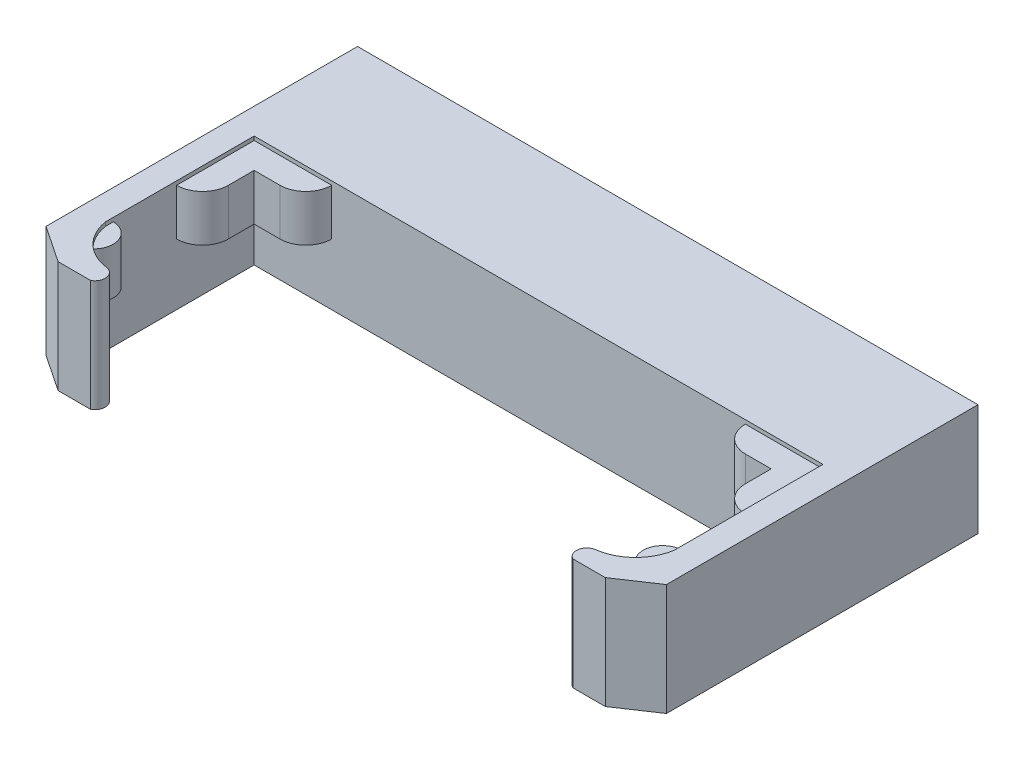
ISO-10303-21;
HEADER;
FILE_DESCRIPTION(('STEP AP214'),'2;1');
FILE_NAME('part.step','',(''),(''),'','','');
FILE_SCHEMA(('AUTOMOTIVE_DESIGN { 1 0 10303 214 1 1 1 1 }'));
ENDSEC;
DATA;
#1=APPLICATION_CONTEXT('core data for automotive mechanical design processes');
#2=APPLICATION_PROTOCOL_DEFINITION('international standard','automotive_design',2000,#1);
#3=PRODUCT_CONTEXT('',#1,'mechanical');
#4=PRODUCT('Part','Part','',(#3));
#5=PRODUCT_RELATED_PRODUCT_CATEGORY('part','',(#4));
#6=PRODUCT_DEFINITION_FORMATION('','',#4);
#7=PRODUCT_DEFINITION_CONTEXT('part definition',#1,'design');
#8=PRODUCT_DEFINITION('design','',#6,#7);
#9=PRODUCT_DEFINITION_SHAPE('','',#8);
#10=(LENGTH_UNIT() NAMED_UNIT(*) SI_UNIT(.MILLI.,.METRE.));
#11=(NAMED_UNIT(*) PLANE_ANGLE_UNIT() SI_UNIT($,.RADIAN.));
#12=(NAMED_UNIT(*) SI_UNIT($,.STERADIAN.) SOLID_ANGLE_UNIT());
#13=UNCERTAINTY_MEASURE_WITH_UNIT(LENGTH_MEASURE(1.E-05),#10,'distance_accuracy_value','');
#14=(GEOMETRIC_REPRESENTATION_CONTEXT(3) GLOBAL_UNCERTAINTY_ASSIGNED_CONTEXT((#13)) GLOBAL_UNIT_ASSIGNED_CONTEXT((#10,
#11,#12)) REPRESENTATION_CONTEXT('',''));
#15=CARTESIAN_POINT('',(0.,0.,0.));
#16=DIRECTION('',(0.,0.,1.));
#17=DIRECTION('',(1.,0.,0.));
#18=AXIS2_PLACEMENT_3D('',#15,#16,#17);
#19=CARTESIAN_POINT('',(0.,22.5,0.));
#20=DIRECTION('',(0.,1.,0.));
#21=DIRECTION('',(0.,0.,1.));
#22=AXIS2_PLACEMENT_3D('',#19,#20,#21);
#23=PLANE('',#22);
#24=DIRECTION('',(0.,0.,-1.));
#25=VECTOR('',#24,1.);
#26=CARTESIAN_POINT('',(-110.,22.5,0.));
#27=LINE('',#26,#25);
#28=CARTESIAN_POINT('',(-110.,22.5,-20.));
#29=VERTEX_POINT('',#28);
#30=CARTESIAN_POINT('',(-110.,22.5,-50.));
#31=VERTEX_POINT('',#30);
#32=EDGE_CURVE('E69',#29,#31,#27,.T.);
#33=ORIENTED_EDGE('',*,*,#32,.F.);
#34=CARTESIAN_POINT('',(-110.,22.5,-30.));
#35=DIRECTION('',(0.,1.,0.));
#36=DIRECTION('',(0.,0.,1.));
#37=AXIS2_PLACEMENT_3D('',#34,#35,#36);
#38=CIRCLE('',#37,9.99999999999999);
#39=CARTESIAN_POINT('',(-100.,22.5,-30.));
#40=VERTEX_POINT('',#39);
#41=EDGE_CURVE('E142',#29,#40,#38,.T.);
#42=ORIENTED_EDGE('',*,*,#41,.T.);
#43=DIRECTION('',(0.,0.,1.));
#44=VECTOR('',#43,1.);
#45=CARTESIAN_POINT('',(-100.,22.5,0.));
#46=LINE('',#45,#44);
#47=CARTESIAN_POINT('',(-100.,22.5,-40.));
#48=VERTEX_POINT('',#47);
#49=EDGE_CURVE('E144',#48,#40,#46,.T.);
#50=ORIENTED_EDGE('',*,*,#49,.F.);
#51=DIRECTION('',(1.,0.,0.));
#52=VECTOR('',#51,1.);
#53=CARTESIAN_POINT('',(0.,22.5,-40.));
#54=LINE('',#53,#52);
#55=CARTESIAN_POINT('',(-90.,22.5,-40.));
#56=VERTEX_POINT('',#55);
#57=EDGE_CURVE('E101',#48,#56,#54,.T.);
#58=ORIENTED_EDGE('',*,*,#57,.T.);
#59=CARTESIAN_POINT('',(-90.,22.5,-50.));
#60=DIRECTION('',(0.,1.,0.));
#61=DIRECTION('',(0.,0.,1.));
#62=AXIS2_PLACEMENT_3D('',#59,#60,#61);
#63=CIRCLE('',#62,9.99999999999999);
#64=CARTESIAN_POINT('',(-80.,22.5,-50.));
#65=VERTEX_POINT('',#64);
#66=EDGE_CURVE('E106',#56,#65,#63,.T.);
#67=ORIENTED_EDGE('',*,*,#66,.T.);
#68=DIRECTION('',(1.,0.,0.));
#69=VECTOR('',#68,1.);
#70=CARTESIAN_POINT('',(0.,22.5,-50.));
#71=LINE('',#70,#69);
#72=EDGE_CURVE('E113',#31,#65,#71,.T.);
#73=ORIENTED_EDGE('',*,*,#72,.F.);
#74=EDGE_LOOP('',(#33,#42,#50,#58,#67,#73));
#75=FACE_BOUND('',#74,.T.);
#76=ADVANCED_FACE('F59',(#75),#23,.T.);
#77=CARTESIAN_POINT('',(0.,4.5,0.));
#78=DIRECTION('',(0.,1.,0.));
#79=DIRECTION('',(0.,0.,1.));
#80=AXIS2_PLACEMENT_3D('',#77,#78,#79);
#81=PLANE('',#80);
#82=DIRECTION('',(0.,0.,-1.));
#83=VECTOR('',#82,1.);
#84=CARTESIAN_POINT('',(-110.,4.5,0.));
#85=LINE('',#84,#83);
#86=CARTESIAN_POINT('',(-110.,4.5,-20.));
#87=VERTEX_POINT('',#86);
#88=CARTESIAN_POINT('',(-110.,4.5,-50.));
#89=VERTEX_POINT('',#88);
#90=EDGE_CURVE('E128',#87,#89,#85,.T.);
#91=ORIENTED_EDGE('',*,*,#90,.T.);
#92=DIRECTION('',(1.,0.,0.));
#93=VECTOR('',#92,1.);
#94=CARTESIAN_POINT('',(0.,4.5,-50.));
#95=LINE('',#94,#93);
#96=CARTESIAN_POINT('',(-80.,4.5,-50.));
#97=VERTEX_POINT('',#96);
#98=EDGE_CURVE('E124',#89,#97,#95,.T.);
#99=ORIENTED_EDGE('',*,*,#98,.T.);
#100=CARTESIAN_POINT('',(-90.,4.5,-50.));
#101=DIRECTION('',(0.,1.,0.));
#102=DIRECTION('',(0.,0.,1.));
#103=AXIS2_PLACEMENT_3D('',#100,#101,#102);
#104=CIRCLE('',#103,9.99999999999999);
#105=CARTESIAN_POINT('',(-90.,4.5,-40.));
#106=VERTEX_POINT('',#105);
#107=EDGE_CURVE('E133',#106,#97,#104,.T.);
#108=ORIENTED_EDGE('',*,*,#107,.F.);
#109=DIRECTION('',(1.,0.,0.));
#110=VECTOR('',#109,1.);
#111=CARTESIAN_POINT('',(0.,4.5,-40.));
#112=LINE('',#111,#110);
#113=CARTESIAN_POINT('',(-100.,4.5,-40.));
#114=VERTEX_POINT('',#113);
#115=EDGE_CURVE('E136',#114,#106,#112,.T.);
#116=ORIENTED_EDGE('',*,*,#115,.F.);
#117=DIRECTION('',(0.,0.,1.));
#118=VECTOR('',#117,1.);
#119=CARTESIAN_POINT('',(-100.,4.5,0.));
#120=LINE('',#119,#118);
#121=CARTESIAN_POINT('',(-100.,4.5,-30.));
#122=VERTEX_POINT('',#121);
#123=EDGE_CURVE('E112',#114,#122,#120,.T.);
#124=ORIENTED_EDGE('',*,*,#123,.T.);
#125=CARTESIAN_POINT('',(-110.,4.5,-30.));
#126=DIRECTION('',(0.,1.,0.));
#127=DIRECTION('',(0.,0.,1.));
#128=AXIS2_PLACEMENT_3D('',#125,#126,#127);
#129=CIRCLE('',#128,9.99999999999999);
#130=EDGE_CURVE('E119',#87,#122,#129,.T.);
#131=ORIENTED_EDGE('',*,*,#130,.F.);
#132=EDGE_LOOP('',(#91,#99,#108,#116,#124,#131));
#133=FACE_BOUND('',#132,.T.);
#134=ADVANCED_FACE('F165',(#133),#81,.F.);
#135=CARTESIAN_POINT('',(0.,64.9264068711929,-50.));
#136=DIRECTION('',(0.,0.,-1.));
#137=DIRECTION('',(-1.,0.,0.));
#138=AXIS2_PLACEMENT_3D('',#135,#136,#137);
#139=PLANE('',#138);
#140=DIRECTION('',(0.,-1.,0.));
#141=VECTOR('',#140,1.);
#142=CARTESIAN_POINT('',(-110.,64.9264068711929,-50.));
#143=LINE('',#142,#141);
#144=EDGE_CURVE('E12',#31,#89,#143,.T.);
#145=ORIENTED_EDGE('',*,*,#144,.F.);
#146=ORIENTED_EDGE('',*,*,#72,.T.);
#147=DIRECTION('',(0.,-1.,0.));
#148=VECTOR('',#147,1.);
#149=CARTESIAN_POINT('',(-80.,64.9264068711929,-50.));
#150=LINE('',#149,#148);
#151=EDGE_CURVE('E114',#65,#97,#150,.T.);
#152=ORIENTED_EDGE('',*,*,#151,.T.);
#153=ORIENTED_EDGE('',*,*,#98,.F.);
#154=EDGE_LOOP('',(#145,#146,#152,#153));
#155=FACE_BOUND('',#154,.T.);
#156=ADVANCED_FACE('F123',(#155),#139,.T.);
#157=CARTESIAN_POINT('',(-90.,64.9264068711929,-50.));
#158=DIRECTION('',(0.,-1.,0.));
#159=DIRECTION('',(0.,0.,-1.));
#160=AXIS2_PLACEMENT_3D('',#157,#158,#159);
#161=CYLINDRICAL_SURFACE('',#160,9.99999999999999);
#162=ORIENTED_EDGE('',*,*,#66,.F.);
#163=DIRECTION('',(0.,-1.,0.));
#164=VECTOR('',#163,1.);
#165=CARTESIAN_POINT('',(-90.,64.9264068711929,-40.));
#166=LINE('',#165,#164);
#167=EDGE_CURVE('E139',#56,#106,#166,.T.);
#168=ORIENTED_EDGE('',*,*,#167,.T.);
#169=ORIENTED_EDGE('',*,*,#107,.T.);
#170=ORIENTED_EDGE('',*,*,#151,.F.);
#171=EDGE_LOOP('',(#162,#168,#169,#170));
#172=FACE_BOUND('',#171,.T.);
#173=ADVANCED_FACE('F157',(#172),#161,.T.);
#174=CARTESIAN_POINT('',(0.,64.9264068711929,-40.));
#175=DIRECTION('',(0.,0.,-1.));
#176=DIRECTION('',(-1.,0.,0.));
#177=AXIS2_PLACEMENT_3D('',#174,#175,#176);
#178=PLANE('',#177);
#179=ORIENTED_EDGE('',*,*,#57,.F.);
#180=DIRECTION('',(0.,-1.,0.));
#181=VECTOR('',#180,1.);
#182=CARTESIAN_POINT('',(-100.,64.9264068711929,-40.));
#183=LINE('',#182,#181);
#184=EDGE_CURVE('E140',#48,#114,#183,.T.);
#185=ORIENTED_EDGE('',*,*,#184,.T.);
#186=ORIENTED_EDGE('',*,*,#115,.T.);
#187=ORIENTED_EDGE('',*,*,#167,.F.);
#188=EDGE_LOOP('',(#179,#185,#186,#187));
#189=FACE_BOUND('',#188,.T.);
#190=ADVANCED_FACE('F159',(#189),#178,.F.);
#191=CARTESIAN_POINT('',(-100.,64.9264068711929,0.));
#192=DIRECTION('',(1.,0.,0.));
#193=DIRECTION('',(0.,0.,-1.));
#194=AXIS2_PLACEMENT_3D('',#191,#192,#193);
#195=PLANE('',#194);
#196=ORIENTED_EDGE('',*,*,#184,.F.);
#197=ORIENTED_EDGE('',*,*,#49,.T.);
#198=DIRECTION('',(0.,-1.,0.));
#199=VECTOR('',#198,1.);
#200=CARTESIAN_POINT('',(-100.,64.9264068711929,-30.));
#201=LINE('',#200,#199);
#202=EDGE_CURVE('E148',#40,#122,#201,.T.);
#203=ORIENTED_EDGE('',*,*,#202,.T.);
#204=ORIENTED_EDGE('',*,*,#123,.F.);
#205=EDGE_LOOP('',(#196,#197,#203,#204));
#206=FACE_BOUND('',#205,.T.);
#207=ADVANCED_FACE('F177',(#206),#195,.T.);
#208=CARTESIAN_POINT('',(-110.,64.9264068711929,-30.));
#209=DIRECTION('',(0.,-1.,0.));
#210=DIRECTION('',(0.,0.,-1.));
#211=AXIS2_PLACEMENT_3D('',#208,#209,#210);
#212=CYLINDRICAL_SURFACE('',#211,9.99999999999999);
#213=ORIENTED_EDGE('',*,*,#41,.F.);
#214=DIRECTION('',(0.,-1.,0.));
#215=VECTOR('',#214,1.);
#216=CARTESIAN_POINT('',(-110.,64.9264068711929,-20.));
#217=LINE('',#216,#215);
#218=EDGE_CURVE('E118',#29,#87,#217,.T.);
#219=ORIENTED_EDGE('',*,*,#218,.T.);
#220=ORIENTED_EDGE('',*,*,#130,.T.);
#221=ORIENTED_EDGE('',*,*,#202,.F.);
#222=EDGE_LOOP('',(#213,#219,#220,#221));
#223=FACE_BOUND('',#222,.T.);
#224=ADVANCED_FACE('F174',(#223),#212,.T.);
#225=CARTESIAN_POINT('',(-110.,64.9264068711929,0.));
#226=DIRECTION('',(-1.,0.,0.));
#227=DIRECTION('',(0.,0.,1.));
#228=AXIS2_PLACEMENT_3D('',#225,#226,#227);
#229=PLANE('',#228);
#230=ORIENTED_EDGE('',*,*,#218,.F.);
#231=ORIENTED_EDGE('',*,*,#32,.T.);
#232=ORIENTED_EDGE('',*,*,#144,.T.);
#233=ORIENTED_EDGE('',*,*,#90,.F.);
#234=EDGE_LOOP('',(#230,#231,#232,#233));
#235=FACE_BOUND('',#234,.T.);
#236=ADVANCED_FACE('F120',(#235),#229,.T.);
#237=CLOSED_SHELL('',(#76,#134,#156,#173,#190,#207,#224,#236));
#238=MANIFOLD_SOLID_BREP('B2',#237);
#239=CARTESIAN_POINT('',(-110.,64.9264068711929,-2.03540887847945E-13));
#240=DIRECTION('',(1.,0.,0.));
#241=DIRECTION('',(0.,0.,-1.));
#242=AXIS2_PLACEMENT_3D('',#239,#240,#241);
#243=PLANE('',#242);
#244=DIRECTION('',(0.,0.,1.));
#245=VECTOR('',#244,1.);
#246=CARTESIAN_POINT('',(-110.,22.5,-2.03540887847945E-13));
#247=LINE('',#246,#245);
#248=CARTESIAN_POINT('',(-110.,22.5,4.5));
#249=VERTEX_POINT('',#248);
#250=CARTESIAN_POINT('',(-110.,22.5,19.5));
#251=VERTEX_POINT('',#250);
#252=EDGE_CURVE('E57',#249,#251,#247,.T.);
#253=ORIENTED_EDGE('',*,*,#252,.F.);
#254=DIRECTION('',(0.,-1.,0.));
#255=VECTOR('',#254,1.);
#256=CARTESIAN_POINT('',(-110.,64.9264068711929,4.5));
#257=LINE('',#256,#255);
#258=CARTESIAN_POINT('',(-110.,4.5,4.5));
#259=VERTEX_POINT('',#258);
#260=EDGE_CURVE('E287',#249,#259,#257,.T.);
#261=ORIENTED_EDGE('',*,*,#260,.T.);
#262=DIRECTION('',(0.,0.,1.));
#263=VECTOR('',#262,1.);
#264=CARTESIAN_POINT('',(-110.,4.5,-2.03540887847945E-13));
#265=LINE('',#264,#263);
#266=CARTESIAN_POINT('',(-110.,4.5,19.5));
#267=VERTEX_POINT('',#266);
#268=EDGE_CURVE('E312',#259,#267,#265,.T.);
#269=ORIENTED_EDGE('',*,*,#268,.T.);
#270=DIRECTION('',(0.,-1.,0.));
#271=VECTOR('',#270,1.);
#272=CARTESIAN_POINT('',(-110.,64.9264068711929,19.5));
#273=LINE('',#272,#271);
#274=EDGE_CURVE('E304',#251,#267,#273,.T.);
#275=ORIENTED_EDGE('',*,*,#274,.F.);
#276=EDGE_LOOP('',(#253,#261,#269,#275));
#277=FACE_BOUND('',#276,.T.);
#278=ADVANCED_FACE('F285',(#277),#243,.F.);
#279=CARTESIAN_POINT('',(-110.,64.9264068711929,12.));
#280=DIRECTION('',(0.,-1.,0.));
#281=DIRECTION('',(0.,0.,-1.));
#282=AXIS2_PLACEMENT_3D('',#279,#280,#281);
#283=CYLINDRICAL_SURFACE('',#282,7.5);
#284=CARTESIAN_POINT('',(-110.,22.5,12.));
#285=DIRECTION('',(0.,1.,0.));
#286=DIRECTION('',(0.,0.,1.));
#287=AXIS2_PLACEMENT_3D('',#284,#285,#286);
#288=CIRCLE('',#287,7.5);
#289=EDGE_CURVE('E294',#251,#249,#288,.T.);
#290=ORIENTED_EDGE('',*,*,#289,.F.);
#291=ORIENTED_EDGE('',*,*,#274,.T.);
#292=CARTESIAN_POINT('',(-110.,4.5,12.));
#293=DIRECTION('',(0.,1.,0.));
#294=DIRECTION('',(0.,0.,1.));
#295=AXIS2_PLACEMENT_3D('',#292,#293,#294);
#296=CIRCLE('',#295,7.5);
#297=EDGE_CURVE('E314',#267,#259,#296,.T.);
#298=ORIENTED_EDGE('',*,*,#297,.T.);
#299=ORIENTED_EDGE('',*,*,#260,.F.);
#300=EDGE_LOOP('',(#290,#291,#298,#299));
#301=FACE_BOUND('',#300,.T.);
#302=ADVANCED_FACE('F311',(#301),#283,.T.);
#303=CARTESIAN_POINT('',(0.,4.5,0.));
#304=DIRECTION('',(0.,1.,0.));
#305=DIRECTION('',(0.,0.,1.));
#306=AXIS2_PLACEMENT_3D('',#303,#304,#305);
#307=PLANE('',#306);
#308=ORIENTED_EDGE('',*,*,#268,.F.);
#309=ORIENTED_EDGE('',*,*,#297,.F.);
#310=EDGE_LOOP('',(#308,#309));
#311=FACE_BOUND('',#310,.T.);
#312=ADVANCED_FACE('F316',(#311),#307,.F.);
#313=CARTESIAN_POINT('',(0.,22.5,0.));
#314=DIRECTION('',(0.,1.,0.));
#315=DIRECTION('',(0.,0.,1.));
#316=AXIS2_PLACEMENT_3D('',#313,#314,#315);
#317=PLANE('',#316);
#318=ORIENTED_EDGE('',*,*,#289,.T.);
#319=ORIENTED_EDGE('',*,*,#252,.T.);
#320=EDGE_LOOP('',(#318,#319));
#321=FACE_BOUND('',#320,.T.);
#322=ADVANCED_FACE('F281',(#321),#317,.T.);
#323=CLOSED_SHELL('',(#278,#302,#312,#322));
#324=MANIFOLD_SOLID_BREP('B6',#323);
#325=CARTESIAN_POINT('',(92.2220271706998,-19.2,4.68154615424301));
#326=DIRECTION('',(0.,1.,0.));
#327=DIRECTION('',(0.,0.,1.));
#328=AXIS2_PLACEMENT_3D('',#325,#326,#327);
#329=CYLINDRICAL_SURFACE('',#328,18.);
#330=DIRECTION('',(0.,-1.,0.));
#331=VECTOR('',#330,1.);
#332=CARTESIAN_POINT('',(104.879251681578,13.5,17.4797752380349));
#333=LINE('',#332,#331);
#334=CARTESIAN_POINT('',(104.879251681578,22.5,17.4797752380349));
#335=VERTEX_POINT('',#334);
#336=CARTESIAN_POINT('',(104.879251681578,4.5,17.4797752380349));
#337=VERTEX_POINT('',#336);
#338=EDGE_CURVE('E396',#335,#337,#333,.T.);
#339=ORIENTED_EDGE('',*,*,#338,.T.);
#340=CARTESIAN_POINT('',(92.2220271706998,4.5,4.68154615424301));
#341=DIRECTION('',(0.,1.,0.));
#342=DIRECTION('',(0.,0.,1.));
#343=AXIS2_PLACEMENT_3D('',#340,#341,#342);
#344=CIRCLE('',#343,18.);
#345=CARTESIAN_POINT('',(110.,4.5,7.50000000000001));
#346=VERTEX_POINT('',#345);
#347=EDGE_CURVE('E598',#337,#346,#344,.T.);
#348=ORIENTED_EDGE('',*,*,#347,.T.);
#349=DIRECTION('',(0.,1.,0.));
#350=VECTOR('',#349,1.);
#351=CARTESIAN_POINT('',(110.,-19.2,7.50000000000001));
#352=LINE('',#351,#350);
#353=CARTESIAN_POINT('',(110.,-19.2,7.50000000000001));
#354=VERTEX_POINT('',#353);
#355=EDGE_CURVE('E691',#354,#346,#352,.T.);
#356=ORIENTED_EDGE('',*,*,#355,.F.);
#357=CARTESIAN_POINT('',(92.2220271706998,-19.2,4.68154615424301));
#358=DIRECTION('',(0.,-1.,0.));
#359=DIRECTION('',(0.,0.,1.));
#360=AXIS2_PLACEMENT_3D('',#357,#358,#359);
#361=CIRCLE('',#360,18.);
#362=CARTESIAN_POINT('',(94.5,-19.2,22.5368209992005));
#363=VERTEX_POINT('',#362);
#364=EDGE_CURVE('E667',#354,#363,#361,.T.);
#365=ORIENTED_EDGE('',*,*,#364,.T.);
#366=DIRECTION('',(0.,1.,0.));
#367=VECTOR('',#366,1.);
#368=CARTESIAN_POINT('',(94.5,-19.2,22.5368209992005));
#369=LINE('',#368,#367);
#370=CARTESIAN_POINT('',(94.5,24.,22.5368209992005));
#371=VERTEX_POINT('',#370);
#372=EDGE_CURVE('E688',#363,#371,#369,.T.);
#373=ORIENTED_EDGE('',*,*,#372,.T.);
#374=CARTESIAN_POINT('',(92.2220271706998,24.,4.68154615424301));
#375=DIRECTION('',(0.,-1.,0.));
#376=DIRECTION('',(0.,0.,1.));
#377=AXIS2_PLACEMENT_3D('',#374,#375,#376);
#378=CIRCLE('',#377,18.);
#379=CARTESIAN_POINT('',(110.,24.,7.50000000000001));
#380=VERTEX_POINT('',#379);
#381=EDGE_CURVE('E632',#380,#371,#378,.T.);
#382=ORIENTED_EDGE('',*,*,#381,.F.);
#383=CARTESIAN_POINT('',(110.,22.5,7.50000000000001));
#384=VERTEX_POINT('',#383);
#385=EDGE_CURVE('E692',#384,#380,#352,.T.);
#386=ORIENTED_EDGE('',*,*,#385,.F.);
#387=CARTESIAN_POINT('',(92.2220271706998,22.5,4.68154615424301));
#388=DIRECTION('',(0.,1.,0.));
#389=DIRECTION('',(0.,0.,1.));
#390=AXIS2_PLACEMENT_3D('',#387,#388,#389);
#391=CIRCLE('',#390,18.);
#392=EDGE_CURVE('E596',#335,#384,#391,.T.);
#393=ORIENTED_EDGE('',*,*,#392,.F.);
#394=EDGE_LOOP('',(#339,#348,#356,#365,#373,#382,#386,#393));
#395=FACE_BOUND('',#394,.T.);
#396=ADVANCED_FACE('F371',(#395),#329,.F.);
#397=CARTESIAN_POINT('',(110.,-19.2,7.50000000000001));
#398=DIRECTION('',(-1.,0.,0.));
#399=DIRECTION('',(0.,0.,1.));
#400=AXIS2_PLACEMENT_3D('',#397,#398,#399);
#401=PLANE('',#400);
#402=DIRECTION('',(0.,0.,-1.));
#403=VECTOR('',#402,1.);
#404=CARTESIAN_POINT('',(110.,22.5,0.));
#405=LINE('',#404,#403);
#406=CARTESIAN_POINT('',(110.,22.5,-20.));
#407=VERTEX_POINT('',#406);
#408=CARTESIAN_POINT('',(110.,22.5,-50.));
#409=VERTEX_POINT('',#408);
#410=EDGE_CURVE('E545',#407,#409,#405,.T.);
#411=ORIENTED_EDGE('',*,*,#410,.F.);
#412=DIRECTION('',(0.,-1.,0.));
#413=VECTOR('',#412,1.);
#414=CARTESIAN_POINT('',(110.,64.9264068711929,-20.));
#415=LINE('',#414,#413);
#416=CARTESIAN_POINT('',(110.,4.5,-20.));
#417=VERTEX_POINT('',#416);
#418=EDGE_CURVE('E529',#407,#417,#415,.T.);
#419=ORIENTED_EDGE('',*,*,#418,.T.);
#420=DIRECTION('',(0.,0.,-1.));
#421=VECTOR('',#420,1.);
#422=CARTESIAN_POINT('',(110.,4.5,0.));
#423=LINE('',#422,#421);
#424=CARTESIAN_POINT('',(110.,4.5,-50.));
#425=VERTEX_POINT('',#424);
#426=EDGE_CURVE('E563',#417,#425,#423,.T.);
#427=ORIENTED_EDGE('',*,*,#426,.T.);
#428=DIRECTION('',(0.,1.,0.));
#429=VECTOR('',#428,1.);
#430=CARTESIAN_POINT('',(110.,-19.2,-50.));
#431=LINE('',#430,#429);
#432=CARTESIAN_POINT('',(110.,-19.2,-50.));
#433=VERTEX_POINT('',#432);
#434=EDGE_CURVE('E696',#433,#425,#431,.T.);
#435=ORIENTED_EDGE('',*,*,#434,.F.);
#436=DIRECTION('',(0.,0.,1.));
#437=VECTOR('',#436,1.);
#438=CARTESIAN_POINT('',(110.,-19.2,7.50000000000001));
#439=LINE('',#438,#437);
#440=EDGE_CURVE('E666',#433,#354,#439,.T.);
#441=ORIENTED_EDGE('',*,*,#440,.T.);
#442=ORIENTED_EDGE('',*,*,#355,.T.);
#443=DIRECTION('',(0.,0.,1.));
#444=VECTOR('',#443,1.);
#445=CARTESIAN_POINT('',(110.,4.5,-2.03540887847945E-13));
#446=LINE('',#445,#444);
#447=CARTESIAN_POINT('',(110.,4.5,4.5));
#448=VERTEX_POINT('',#447);
#449=EDGE_CURVE('E590',#448,#346,#446,.T.);
#450=ORIENTED_EDGE('',*,*,#449,.F.);
#451=DIRECTION('',(0.,-1.,0.));
#452=VECTOR('',#451,1.);
#453=CARTESIAN_POINT('',(110.,64.9264068711929,4.5));
#454=LINE('',#453,#452);
#455=CARTESIAN_POINT('',(110.,22.5,4.5));
#456=VERTEX_POINT('',#455);
#457=EDGE_CURVE('E581',#456,#448,#454,.T.);
#458=ORIENTED_EDGE('',*,*,#457,.F.);
#459=DIRECTION('',(0.,0.,1.));
#460=VECTOR('',#459,1.);
#461=CARTESIAN_POINT('',(110.,22.5,-2.03540887847945E-13));
#462=LINE('',#461,#460);
#463=EDGE_CURVE('E536',#456,#384,#462,.T.);
#464=ORIENTED_EDGE('',*,*,#463,.T.);
#465=ORIENTED_EDGE('',*,*,#385,.T.);
#466=DIRECTION('',(0.,0.,1.));
#467=VECTOR('',#466,1.);
#468=CARTESIAN_POINT('',(110.,24.,7.50000000000001));
#469=LINE('',#468,#467);
#470=CARTESIAN_POINT('',(110.,24.,-50.));
#471=VERTEX_POINT('',#470);
#472=EDGE_CURVE('E626',#471,#380,#469,.T.);
#473=ORIENTED_EDGE('',*,*,#472,.F.);
#474=EDGE_CURVE('E552',#409,#471,#431,.T.);
#475=ORIENTED_EDGE('',*,*,#474,.F.);
#476=EDGE_LOOP('',(#411,#419,#427,#435,#441,#442,#450,#458,#464,#465,#473,#475));
#477=FACE_BOUND('',#476,.T.);
#478=ADVANCED_FACE('F548',(#477),#401,.T.);
#479=CARTESIAN_POINT('',(-120.,-19.2,-100.));
#480=DIRECTION('',(0.,0.,-1.));
#481=DIRECTION('',(-1.,0.,0.));
#482=AXIS2_PLACEMENT_3D('',#479,#480,#481);
#483=PLANE('',#482);
#484=DIRECTION('',(0.,1.,0.));
#485=VECTOR('',#484,1.);
#486=CARTESIAN_POINT('',(-120.,-19.2,-100.));
#487=LINE('',#486,#485);
#488=CARTESIAN_POINT('',(-120.,-19.2,-100.));
#489=VERTEX_POINT('',#488);
#490=CARTESIAN_POINT('',(-120.,24.,-100.));
#491=VERTEX_POINT('',#490);
#492=EDGE_CURVE('E279',#489,#491,#487,.T.);
#493=ORIENTED_EDGE('',*,*,#492,.T.);
#494=DIRECTION('',(-1.,0.,0.));
#495=VECTOR('',#494,1.);
#496=CARTESIAN_POINT('',(-120.,24.,-100.));
#497=LINE('',#496,#495);
#498=CARTESIAN_POINT('',(120.,24.,-100.));
#499=VERTEX_POINT('',#498);
#500=EDGE_CURVE('E642',#499,#491,#497,.T.);
#501=ORIENTED_EDGE('',*,*,#500,.F.);
#502=DIRECTION('',(0.,1.,0.));
#503=VECTOR('',#502,1.);
#504=CARTESIAN_POINT('',(120.,-19.2,-100.));
#505=LINE('',#504,#503);
#506=CARTESIAN_POINT('',(120.,-19.2,-100.));
#507=VERTEX_POINT('',#506);
#508=EDGE_CURVE('E378',#507,#499,#505,.T.);
#509=ORIENTED_EDGE('',*,*,#508,.F.);
#510=DIRECTION('',(-1.,0.,0.));
#511=VECTOR('',#510,1.);
#512=CARTESIAN_POINT('',(-120.,-19.2,-100.));
#513=LINE('',#512,#511);
#514=EDGE_CURVE('E682',#507,#489,#513,.T.);
#515=ORIENTED_EDGE('',*,*,#514,.T.);
#516=EDGE_LOOP('',(#493,#501,#509,#515));
#517=FACE_BOUND('',#516,.T.);
#518=ADVANCED_FACE('F768',(#517),#483,.T.);
#519=CARTESIAN_POINT('',(120.,-19.2,-100.));
#520=DIRECTION('',(1.,0.,0.));
#521=DIRECTION('',(0.,0.,-1.));
#522=AXIS2_PLACEMENT_3D('',#519,#520,#521);
#523=PLANE('',#522);
#524=ORIENTED_EDGE('',*,*,#508,.T.);
#525=DIRECTION('',(0.,0.,-1.));
#526=VECTOR('',#525,1.);
#527=CARTESIAN_POINT('',(120.,24.,-50.));
#528=LINE('',#527,#526);
#529=CARTESIAN_POINT('',(120.,24.,20.5094860364625));
#530=VERTEX_POINT('',#529);
#531=EDGE_CURVE('E641',#530,#499,#528,.T.);
#532=ORIENTED_EDGE('',*,*,#531,.F.);
#533=DIRECTION('',(0.,1.,0.));
#534=VECTOR('',#533,1.);
#535=CARTESIAN_POINT('',(120.,-19.2,20.5094860364625));
#536=LINE('',#535,#534);
#537=CARTESIAN_POINT('',(120.,-19.2,20.5094860364625));
#538=VERTEX_POINT('',#537);
#539=EDGE_CURVE('E607',#538,#530,#536,.T.);
#540=ORIENTED_EDGE('',*,*,#539,.F.);
#541=DIRECTION('',(0.,0.,-1.));
#542=VECTOR('',#541,1.);
#543=CARTESIAN_POINT('',(120.,-19.2,-50.));
#544=LINE('',#543,#542);
#545=EDGE_CURVE('E676',#538,#507,#544,.T.);
#546=ORIENTED_EDGE('',*,*,#545,.T.);
#547=EDGE_LOOP('',(#524,#532,#540,#546));
#548=FACE_BOUND('',#547,.T.);
#549=ADVANCED_FACE('F802',(#548),#523,.T.);
#550=CARTESIAN_POINT('',(105.831019796753,-19.2,30.));
#551=DIRECTION('',(0.,0.,1.));
#552=DIRECTION('',(1.,0.,0.));
#553=AXIS2_PLACEMENT_3D('',#550,#551,#552);
#554=PLANE('',#553);
#555=DIRECTION('',(0.,1.,0.));
#556=VECTOR('',#555,1.);
#557=CARTESIAN_POINT('',(105.831019796753,-19.2,30.));
#558=LINE('',#557,#556);
#559=CARTESIAN_POINT('',(105.831019796753,-19.2,30.));
#560=VERTEX_POINT('',#559);
#561=CARTESIAN_POINT('',(105.831019796753,24.,30.));
#562=VERTEX_POINT('',#561);
#563=EDGE_CURVE('E683',#560,#562,#558,.T.);
#564=ORIENTED_EDGE('',*,*,#563,.T.);
#565=DIRECTION('',(1.,0.,0.));
#566=VECTOR('',#565,1.);
#567=CARTESIAN_POINT('',(105.831019796753,24.,30.));
#568=LINE('',#567,#566);
#569=CARTESIAN_POINT('',(93.25,24.,30.));
#570=VERTEX_POINT('',#569);
#571=EDGE_CURVE('E636',#570,#562,#568,.T.);
#572=ORIENTED_EDGE('',*,*,#571,.F.);
#573=DIRECTION('',(0.,1.,0.));
#574=VECTOR('',#573,1.);
#575=CARTESIAN_POINT('',(93.25,-19.2,30.));
#576=LINE('',#575,#574);
#577=CARTESIAN_POINT('',(93.25,-19.2,30.));
#578=VERTEX_POINT('',#577);
#579=EDGE_CURVE('E689',#578,#570,#576,.T.);
#580=ORIENTED_EDGE('',*,*,#579,.F.);
#581=DIRECTION('',(1.,0.,0.));
#582=VECTOR('',#581,1.);
#583=CARTESIAN_POINT('',(105.831019796753,-19.2,30.));
#584=LINE('',#583,#582);
#585=EDGE_CURVE('E677',#578,#560,#584,.T.);
#586=ORIENTED_EDGE('',*,*,#585,.T.);
#587=EDGE_LOOP('',(#564,#572,#580,#586));
#588=FACE_BOUND('',#587,.T.);
#589=ADVANCED_FACE('F804',(#588),#554,.T.);
#590=CARTESIAN_POINT('',(95.1559154698416,-19.2,26.4829496841931));
#591=DIRECTION('',(0.,1.,0.));
#592=DIRECTION('',(0.,0.,1.));
#593=AXIS2_PLACEMENT_3D('',#590,#591,#592);
#594=CYLINDRICAL_SURFACE('',#593,4.0002695786783);
#595=ORIENTED_EDGE('',*,*,#579,.T.);
#596=CARTESIAN_POINT('',(95.1559154698416,24.,26.4829496841931));
#597=DIRECTION('',(0.,1.,0.));
#598=DIRECTION('',(0.,0.,-1.));
#599=AXIS2_PLACEMENT_3D('',#596,#597,#598);
#600=CIRCLE('',#599,4.0002695786783);
#601=EDGE_CURVE('E634',#371,#570,#600,.T.);
#602=ORIENTED_EDGE('',*,*,#601,.F.);
#603=ORIENTED_EDGE('',*,*,#372,.F.);
#604=CARTESIAN_POINT('',(95.1559154698416,-19.2,26.4829496841931));
#605=DIRECTION('',(0.,1.,0.));
#606=DIRECTION('',(0.,0.,-1.));
#607=AXIS2_PLACEMENT_3D('',#604,#605,#606);
#608=CIRCLE('',#607,4.0002695786783);
#609=EDGE_CURVE('E674',#363,#578,#608,.T.);
#610=ORIENTED_EDGE('',*,*,#609,.T.);
#611=EDGE_LOOP('',(#595,#602,#603,#610));
#612=FACE_BOUND('',#611,.T.);
#613=ADVANCED_FACE('F772',(#612),#594,.T.);
#614=CARTESIAN_POINT('',(-110.,-19.2,-50.));
#615=DIRECTION('',(0.,0.,1.));
#616=DIRECTION('',(1.,0.,0.));
#617=AXIS2_PLACEMENT_3D('',#614,#615,#616);
#618=PLANE('',#617);
#619=DIRECTION('',(-1.,0.,0.));
#620=VECTOR('',#619,1.);
#621=CARTESIAN_POINT('',(0.,22.5,-50.));
#622=LINE('',#621,#620);
#623=CARTESIAN_POINT('',(80.,22.5,-50.));
#624=VERTEX_POINT('',#623);
#625=EDGE_CURVE('E389',#409,#624,#622,.T.);
#626=ORIENTED_EDGE('',*,*,#625,.F.);
#627=ORIENTED_EDGE('',*,*,#474,.T.);
#628=DIRECTION('',(1.,0.,0.));
#629=VECTOR('',#628,1.);
#630=CARTESIAN_POINT('',(-110.,24.,-50.));
#631=LINE('',#630,#629);
#632=CARTESIAN_POINT('',(-110.,24.,-50.));
#633=VERTEX_POINT('',#632);
#634=EDGE_CURVE('E627',#633,#471,#631,.T.);
#635=ORIENTED_EDGE('',*,*,#634,.F.);
#636=DIRECTION('',(0.,1.,0.));
#637=VECTOR('',#636,1.);
#638=CARTESIAN_POINT('',(-110.,-19.2,-50.));
#639=LINE('',#638,#637);
#640=CARTESIAN_POINT('',(-110.,-19.2,-50.));
#641=VERTEX_POINT('',#640);
#642=EDGE_CURVE('E698',#641,#633,#639,.T.);
#643=ORIENTED_EDGE('',*,*,#642,.F.);
#644=DIRECTION('',(1.,0.,0.));
#645=VECTOR('',#644,1.);
#646=CARTESIAN_POINT('',(-110.,-19.2,-50.));
#647=LINE('',#646,#645);
#648=EDGE_CURVE('E661',#641,#433,#647,.T.);
#649=ORIENTED_EDGE('',*,*,#648,.T.);
#650=ORIENTED_EDGE('',*,*,#434,.T.);
#651=DIRECTION('',(-1.,0.,0.));
#652=VECTOR('',#651,1.);
#653=CARTESIAN_POINT('',(0.,4.5,-50.));
#654=LINE('',#653,#652);
#655=CARTESIAN_POINT('',(80.,4.5,-50.));
#656=VERTEX_POINT('',#655);
#657=EDGE_CURVE('E561',#425,#656,#654,.T.);
#658=ORIENTED_EDGE('',*,*,#657,.T.);
#659=DIRECTION('',(0.,-1.,0.));
#660=VECTOR('',#659,1.);
#661=CARTESIAN_POINT('',(80.,64.9264068711929,-50.));
#662=LINE('',#661,#660);
#663=EDGE_CURVE('E576',#624,#656,#662,.T.);
#664=ORIENTED_EDGE('',*,*,#663,.F.);
#665=EDGE_LOOP('',(#626,#627,#635,#643,#649,#650,#658,#664));
#666=FACE_BOUND('',#665,.T.);
#667=ADVANCED_FACE('F736',(#666),#618,.T.);
#668=CARTESIAN_POINT('',(-110.,-19.2,-50.));
#669=DIRECTION('',(1.,0.,0.));
#670=DIRECTION('',(0.,0.,-1.));
#671=AXIS2_PLACEMENT_3D('',#668,#669,#670);
#672=PLANE('',#671);
#673=ORIENTED_EDGE('',*,*,#642,.T.);
#674=DIRECTION('',(0.,0.,-1.));
#675=VECTOR('',#674,1.);
#676=CARTESIAN_POINT('',(-110.,24.,-50.));
#677=LINE('',#676,#675);
#678=CARTESIAN_POINT('',(-110.,24.,7.50000000000001));
#679=VERTEX_POINT('',#678);
#680=EDGE_CURVE('E624',#679,#633,#677,.T.);
#681=ORIENTED_EDGE('',*,*,#680,.F.);
#682=DIRECTION('',(0.,1.,0.));
#683=VECTOR('',#682,1.);
#684=CARTESIAN_POINT('',(-110.,-19.2,7.50000000000001));
#685=LINE('',#684,#683);
#686=CARTESIAN_POINT('',(-110.,-19.2,7.50000000000001));
#687=VERTEX_POINT('',#686);
#688=EDGE_CURVE('E702',#687,#679,#685,.T.);
#689=ORIENTED_EDGE('',*,*,#688,.F.);
#690=DIRECTION('',(0.,0.,-1.));
#691=VECTOR('',#690,1.);
#692=CARTESIAN_POINT('',(-110.,-19.2,-50.));
#693=LINE('',#692,#691);
#694=EDGE_CURVE('E662',#687,#641,#693,.T.);
#695=ORIENTED_EDGE('',*,*,#694,.T.);
#696=EDGE_LOOP('',(#673,#681,#689,#695));
#697=FACE_BOUND('',#696,.T.);
#698=ADVANCED_FACE('F740',(#697),#672,.T.);
#699=CARTESIAN_POINT('',(-92.2220271706998,-19.2,4.68154615424301));
#700=DIRECTION('',(0.,1.,0.));
#701=DIRECTION('',(0.,0.,1.));
#702=AXIS2_PLACEMENT_3D('',#699,#700,#701);
#703=CYLINDRICAL_SURFACE('',#702,18.);
#704=ORIENTED_EDGE('',*,*,#688,.T.);
#705=CARTESIAN_POINT('',(-92.2220271706998,24.,4.68154615424301));
#706=DIRECTION('',(0.,-1.,0.));
#707=DIRECTION('',(0.,0.,1.));
#708=AXIS2_PLACEMENT_3D('',#705,#706,#707);
#709=CIRCLE('',#708,18.);
#710=CARTESIAN_POINT('',(-94.5,24.,22.5368209992004));
#711=VERTEX_POINT('',#710);
#712=EDGE_CURVE('E617',#711,#679,#709,.T.);
#713=ORIENTED_EDGE('',*,*,#712,.F.);
#714=DIRECTION('',(0.,1.,0.));
#715=VECTOR('',#714,1.);
#716=CARTESIAN_POINT('',(-94.5,-19.2,22.5368209992004));
#717=LINE('',#716,#715);
#718=CARTESIAN_POINT('',(-94.5,-19.2,22.5368209992004));
#719=VERTEX_POINT('',#718);
#720=EDGE_CURVE('E704',#719,#711,#717,.T.);
#721=ORIENTED_EDGE('',*,*,#720,.F.);
#722=CARTESIAN_POINT('',(-92.2220271706998,-19.2,4.68154615424301));
#723=DIRECTION('',(0.,-1.,0.));
#724=DIRECTION('',(0.,0.,1.));
#725=AXIS2_PLACEMENT_3D('',#722,#723,#724);
#726=CIRCLE('',#725,18.);
#727=EDGE_CURVE('E659',#719,#687,#726,.T.);
#728=ORIENTED_EDGE('',*,*,#727,.T.);
#729=EDGE_LOOP('',(#704,#713,#721,#728));
#730=FACE_BOUND('',#729,.T.);
#731=ADVANCED_FACE('F735',(#730),#703,.F.);
#732=CARTESIAN_POINT('',(-95.1559154698416,-19.2,26.4829496841931));
#733=DIRECTION('',(0.,1.,0.));
#734=DIRECTION('',(0.,0.,1.));
#735=AXIS2_PLACEMENT_3D('',#732,#733,#734);
#736=CYLINDRICAL_SURFACE('',#735,4.0002695786783);
#737=ORIENTED_EDGE('',*,*,#720,.T.);
#738=CARTESIAN_POINT('',(-95.1559154698416,24.,26.4829496841931));
#739=DIRECTION('',(0.,1.,0.));
#740=DIRECTION('',(0.,0.,-1.));
#741=AXIS2_PLACEMENT_3D('',#738,#739,#740);
#742=CIRCLE('',#741,4.0002695786783);
#743=CARTESIAN_POINT('',(-93.25,24.,30.));
#744=VERTEX_POINT('',#743);
#745=EDGE_CURVE('E616',#744,#711,#742,.T.);
#746=ORIENTED_EDGE('',*,*,#745,.F.);
#747=DIRECTION('',(0.,1.,0.));
#748=VECTOR('',#747,1.);
#749=CARTESIAN_POINT('',(-93.25,-19.2,30.));
#750=LINE('',#749,#748);
#751=CARTESIAN_POINT('',(-93.25,-19.2,30.));
#752=VERTEX_POINT('',#751);
#753=EDGE_CURVE('E703',#752,#744,#750,.T.);
#754=ORIENTED_EDGE('',*,*,#753,.F.);
#755=CARTESIAN_POINT('',(-95.1559154698416,-19.2,26.4829496841931));
#756=DIRECTION('',(0.,1.,0.));
#757=DIRECTION('',(0.,0.,-1.));
#758=AXIS2_PLACEMENT_3D('',#755,#756,#757);
#759=CIRCLE('',#758,4.0002695786783);
#760=EDGE_CURVE('E654',#752,#719,#759,.T.);
#761=ORIENTED_EDGE('',*,*,#760,.T.);
#762=EDGE_LOOP('',(#737,#746,#754,#761));
#763=FACE_BOUND('',#762,.T.);
#764=ADVANCED_FACE('F724',(#763),#736,.T.);
#765=CARTESIAN_POINT('',(-93.25,-19.2,30.));
#766=DIRECTION('',(0.,0.,1.));
#767=DIRECTION('',(1.,0.,0.));
#768=AXIS2_PLACEMENT_3D('',#765,#766,#767);
#769=PLANE('',#768);
#770=ORIENTED_EDGE('',*,*,#753,.T.);
#771=DIRECTION('',(1.,0.,0.));
#772=VECTOR('',#771,1.);
#773=CARTESIAN_POINT('',(-93.25,24.,30.));
#774=LINE('',#773,#772);
#775=CARTESIAN_POINT('',(-105.831019796753,24.,30.));
#776=VERTEX_POINT('',#775);
#777=EDGE_CURVE('E611',#776,#744,#774,.T.);
#778=ORIENTED_EDGE('',*,*,#777,.F.);
#779=DIRECTION('',(0.,1.,0.));
#780=VECTOR('',#779,1.);
#781=CARTESIAN_POINT('',(-105.831019796753,-19.2,30.));
#782=LINE('',#781,#780);
#783=CARTESIAN_POINT('',(-105.831019796753,-19.2,30.));
#784=VERTEX_POINT('',#783);
#785=EDGE_CURVE('E708',#784,#776,#782,.T.);
#786=ORIENTED_EDGE('',*,*,#785,.F.);
#787=DIRECTION('',(1.,0.,0.));
#788=VECTOR('',#787,1.);
#789=CARTESIAN_POINT('',(-93.25,-19.2,30.));
#790=LINE('',#789,#788);
#791=EDGE_CURVE('E655',#784,#752,#790,.T.);
#792=ORIENTED_EDGE('',*,*,#791,.T.);
#793=EDGE_LOOP('',(#770,#778,#786,#792));
#794=FACE_BOUND('',#793,.T.);
#795=ADVANCED_FACE('F721',(#794),#769,.T.);
#796=CARTESIAN_POINT('',(-120.,-19.2,20.5094860364625));
#797=DIRECTION('',(-0.556506496968278,0.,0.830843257679868));
#798=DIRECTION('',(0.830843257679869,0.,0.556506496968278));
#799=AXIS2_PLACEMENT_3D('',#796,#797,#798);
#800=PLANE('',#799);
#801=ORIENTED_EDGE('',*,*,#785,.T.);
#802=DIRECTION('',(0.830843257679868,0.,0.556506496968278));
#803=VECTOR('',#802,1.);
#804=CARTESIAN_POINT('',(-120.,24.,20.5094860364625));
#805=LINE('',#804,#803);
#806=CARTESIAN_POINT('',(-120.,24.,20.5094860364625));
#807=VERTEX_POINT('',#806);
#808=EDGE_CURVE('E612',#807,#776,#805,.T.);
#809=ORIENTED_EDGE('',*,*,#808,.F.);
#810=DIRECTION('',(0.,1.,0.));
#811=VECTOR('',#810,1.);
#812=CARTESIAN_POINT('',(-120.,-19.2,20.5094860364625));
#813=LINE('',#812,#811);
#814=CARTESIAN_POINT('',(-120.,-19.2,20.5094860364625));
#815=VERTEX_POINT('',#814);
#816=EDGE_CURVE('E375',#815,#807,#813,.T.);
#817=ORIENTED_EDGE('',*,*,#816,.F.);
#818=DIRECTION('',(0.830843257679868,0.,0.556506496968278));
#819=VECTOR('',#818,1.);
#820=CARTESIAN_POINT('',(-120.,-19.2,20.5094860364625));
#821=LINE('',#820,#819);
#822=EDGE_CURVE('E647',#815,#784,#821,.T.);
#823=ORIENTED_EDGE('',*,*,#822,.T.);
#824=EDGE_LOOP('',(#801,#809,#817,#823));
#825=FACE_BOUND('',#824,.T.);
#826=ADVANCED_FACE('F712',(#825),#800,.T.);
#827=CARTESIAN_POINT('',(-120.,-19.2,20.5094860364625));
#828=DIRECTION('',(-1.,0.,0.));
#829=DIRECTION('',(0.,0.,1.));
#830=AXIS2_PLACEMENT_3D('',#827,#828,#829);
#831=PLANE('',#830);
#832=ORIENTED_EDGE('',*,*,#816,.T.);
#833=DIRECTION('',(0.,0.,1.));
#834=VECTOR('',#833,1.);
#835=CARTESIAN_POINT('',(-120.,24.,-100.));
#836=LINE('',#835,#834);
#837=EDGE_CURVE('E609',#491,#807,#836,.T.);
#838=ORIENTED_EDGE('',*,*,#837,.F.);
#839=ORIENTED_EDGE('',*,*,#492,.F.);
#840=DIRECTION('',(0.,0.,1.));
#841=VECTOR('',#840,1.);
#842=CARTESIAN_POINT('',(-120.,-19.2,-100.));
#843=LINE('',#842,#841);
#844=EDGE_CURVE('E650',#489,#815,#843,.T.);
#845=ORIENTED_EDGE('',*,*,#844,.T.);
#846=EDGE_LOOP('',(#832,#838,#839,#845));
#847=FACE_BOUND('',#846,.T.);
#848=ADVANCED_FACE('F374',(#847),#831,.T.);
#849=CARTESIAN_POINT('',(-95.1559154698416,-19.2,26.4829496841931));
#850=DIRECTION('',(0.,-1.,0.));
#851=DIRECTION('',(0.,0.,-1.));
#852=AXIS2_PLACEMENT_3D('',#849,#850,#851);
#853=PLANE('',#852);
#854=ORIENTED_EDGE('',*,*,#822,.F.);
#855=ORIENTED_EDGE('',*,*,#844,.F.);
#856=ORIENTED_EDGE('',*,*,#514,.F.);
#857=ORIENTED_EDGE('',*,*,#545,.F.);
#858=DIRECTION('',(-0.830843257679868,0.,0.556506496968278));
#859=VECTOR('',#858,1.);
#860=CARTESIAN_POINT('',(120.,-19.2,20.5094860364625));
#861=LINE('',#860,#859);
#862=EDGE_CURVE('E601',#538,#560,#861,.T.);
#863=ORIENTED_EDGE('',*,*,#862,.T.);
#864=ORIENTED_EDGE('',*,*,#585,.F.);
#865=ORIENTED_EDGE('',*,*,#609,.F.);
#866=ORIENTED_EDGE('',*,*,#364,.F.);
#867=ORIENTED_EDGE('',*,*,#440,.F.);
#868=ORIENTED_EDGE('',*,*,#648,.F.);
#869=ORIENTED_EDGE('',*,*,#694,.F.);
#870=ORIENTED_EDGE('',*,*,#727,.F.);
#871=ORIENTED_EDGE('',*,*,#760,.F.);
#872=ORIENTED_EDGE('',*,*,#791,.F.);
#873=EDGE_LOOP('',(#854,#855,#856,#857,#863,#864,#865,#866,#867,#868,#869,#870,#871,#872));
#874=FACE_BOUND('',#873,.T.);
#875=ADVANCED_FACE('F727',(#874),#853,.T.);
#876=CARTESIAN_POINT('',(-95.1559154698416,24.,26.4829496841931));
#877=DIRECTION('',(0.,-1.,0.));
#878=DIRECTION('',(0.,0.,-1.));
#879=AXIS2_PLACEMENT_3D('',#876,#877,#878);
#880=PLANE('',#879);
#881=ORIENTED_EDGE('',*,*,#808,.T.);
#882=ORIENTED_EDGE('',*,*,#777,.T.);
#883=ORIENTED_EDGE('',*,*,#745,.T.);
#884=ORIENTED_EDGE('',*,*,#712,.T.);
#885=ORIENTED_EDGE('',*,*,#680,.T.);
#886=ORIENTED_EDGE('',*,*,#634,.T.);
#887=ORIENTED_EDGE('',*,*,#472,.T.);
#888=ORIENTED_EDGE('',*,*,#381,.T.);
#889=ORIENTED_EDGE('',*,*,#601,.T.);
#890=ORIENTED_EDGE('',*,*,#571,.T.);
#891=DIRECTION('',(-0.830843257679868,0.,0.556506496968278));
#892=VECTOR('',#891,1.);
#893=CARTESIAN_POINT('',(120.,24.,20.5094860364625));
#894=LINE('',#893,#892);
#895=EDGE_CURVE('E605',#530,#562,#894,.T.);
#896=ORIENTED_EDGE('',*,*,#895,.F.);
#897=ORIENTED_EDGE('',*,*,#531,.T.);
#898=ORIENTED_EDGE('',*,*,#500,.T.);
#899=ORIENTED_EDGE('',*,*,#837,.T.);
#900=EDGE_LOOP('',(#881,#882,#883,#884,#885,#886,#887,#888,#889,#890,#896,#897,#898,#899));
#901=FACE_BOUND('',#900,.T.);
#902=ADVANCED_FACE('F718',(#901),#880,.F.);
#903=CARTESIAN_POINT('',(120.,-19.2,20.5094860364625));
#904=DIRECTION('',(-0.556506496968278,0.,-0.830843257679868));
#905=DIRECTION('',(-0.830843257679869,0.,0.556506496968278));
#906=AXIS2_PLACEMENT_3D('',#903,#904,#905);
#907=PLANE('',#906);
#908=ORIENTED_EDGE('',*,*,#539,.T.);
#909=ORIENTED_EDGE('',*,*,#895,.T.);
#910=ORIENTED_EDGE('',*,*,#563,.F.);
#911=ORIENTED_EDGE('',*,*,#862,.F.);
#912=EDGE_LOOP('',(#908,#909,#910,#911));
#913=FACE_BOUND('',#912,.T.);
#914=ADVANCED_FACE('F800',(#913),#907,.F.);
#915=CARTESIAN_POINT('',(110.,64.9264068711929,12.));
#916=DIRECTION('',(0.,-1.,0.));
#917=DIRECTION('',(0.,0.,-1.));
#918=AXIS2_PLACEMENT_3D('',#915,#916,#917);
#919=CYLINDRICAL_SURFACE('',#918,7.5);
#920=ORIENTED_EDGE('',*,*,#338,.F.);
#921=CARTESIAN_POINT('',(110.,22.5,12.));
#922=DIRECTION('',(0.,-1.,0.));
#923=DIRECTION('',(0.,0.,1.));
#924=AXIS2_PLACEMENT_3D('',#921,#922,#923);
#925=CIRCLE('',#924,7.5);
#926=EDGE_CURVE('E588',#335,#456,#925,.T.);
#927=ORIENTED_EDGE('',*,*,#926,.T.);
#928=ORIENTED_EDGE('',*,*,#457,.T.);
#929=CARTESIAN_POINT('',(110.,4.5,12.));
#930=DIRECTION('',(0.,-1.,0.));
#931=DIRECTION('',(0.,0.,1.));
#932=AXIS2_PLACEMENT_3D('',#929,#930,#931);
#933=CIRCLE('',#932,7.5);
#934=EDGE_CURVE('E595',#337,#448,#933,.T.);
#935=ORIENTED_EDGE('',*,*,#934,.F.);
#936=EDGE_LOOP('',(#920,#927,#928,#935));
#937=FACE_BOUND('',#936,.T.);
#938=ADVANCED_FACE('F823',(#937),#919,.T.);
#939=CARTESIAN_POINT('',(0.,4.5,0.));
#940=DIRECTION('',(0.,1.,0.));
#941=DIRECTION('',(0.,0.,1.));
#942=AXIS2_PLACEMENT_3D('',#939,#940,#941);
#943=PLANE('',#942);
#944=ORIENTED_EDGE('',*,*,#347,.F.);
#945=ORIENTED_EDGE('',*,*,#934,.T.);
#946=ORIENTED_EDGE('',*,*,#449,.T.);
#947=EDGE_LOOP('',(#944,#945,#946));
#948=FACE_BOUND('',#947,.T.);
#949=ADVANCED_FACE('F829',(#948),#943,.F.);
#950=CARTESIAN_POINT('',(0.,22.5,0.));
#951=DIRECTION('',(0.,1.,0.));
#952=DIRECTION('',(0.,0.,1.));
#953=AXIS2_PLACEMENT_3D('',#950,#951,#952);
#954=PLANE('',#953);
#955=ORIENTED_EDGE('',*,*,#926,.F.);
#956=ORIENTED_EDGE('',*,*,#392,.T.);
#957=ORIENTED_EDGE('',*,*,#463,.F.);
#958=EDGE_LOOP('',(#955,#956,#957));
#959=FACE_BOUND('',#958,.T.);
#960=ADVANCED_FACE('F835',(#959),#954,.T.);
#961=CARTESIAN_POINT('',(0.,22.5,0.));
#962=DIRECTION('',(0.,1.,0.));
#963=DIRECTION('',(0.,0.,1.));
#964=AXIS2_PLACEMENT_3D('',#961,#962,#963);
#965=PLANE('',#964);
#966=ORIENTED_EDGE('',*,*,#410,.T.);
#967=ORIENTED_EDGE('',*,*,#625,.T.);
#968=CARTESIAN_POINT('',(90.,22.5,-50.));
#969=DIRECTION('',(0.,-1.,0.));
#970=DIRECTION('',(0.,0.,1.));
#971=AXIS2_PLACEMENT_3D('',#968,#969,#970);
#972=CIRCLE('',#971,9.99999999999999);
#973=CARTESIAN_POINT('',(90.,22.5,-40.));
#974=VERTEX_POINT('',#973);
#975=EDGE_CURVE('E556',#974,#624,#972,.T.);
#976=ORIENTED_EDGE('',*,*,#975,.F.);
#977=DIRECTION('',(-1.,0.,0.));
#978=VECTOR('',#977,1.);
#979=CARTESIAN_POINT('',(0.,22.5,-40.));
#980=LINE('',#979,#978);
#981=CARTESIAN_POINT('',(100.,22.5,-40.));
#982=VERTEX_POINT('',#981);
#983=EDGE_CURVE('E553',#982,#974,#980,.T.);
#984=ORIENTED_EDGE('',*,*,#983,.F.);
#985=DIRECTION('',(0.,0.,1.));
#986=VECTOR('',#985,1.);
#987=CARTESIAN_POINT('',(100.,22.5,0.));
#988=LINE('',#987,#986);
#989=CARTESIAN_POINT('',(100.,22.5,-30.));
#990=VERTEX_POINT('',#989);
#991=EDGE_CURVE('E546',#982,#990,#988,.T.);
#992=ORIENTED_EDGE('',*,*,#991,.T.);
#993=CARTESIAN_POINT('',(110.,22.5,-30.));
#994=DIRECTION('',(0.,-1.,0.));
#995=DIRECTION('',(0.,0.,1.));
#996=AXIS2_PLACEMENT_3D('',#993,#994,#995);
#997=CIRCLE('',#996,9.99999999999999);
#998=EDGE_CURVE('E532',#407,#990,#997,.T.);
#999=ORIENTED_EDGE('',*,*,#998,.F.);
#1000=EDGE_LOOP('',(#966,#967,#976,#984,#992,#999));
#1001=FACE_BOUND('',#1000,.T.);
#1002=ADVANCED_FACE('F541',(#1001),#965,.T.);
#1003=CARTESIAN_POINT('',(0.,4.5,0.));
#1004=DIRECTION('',(0.,1.,0.));
#1005=DIRECTION('',(0.,0.,1.));
#1006=AXIS2_PLACEMENT_3D('',#1003,#1004,#1005);
#1007=PLANE('',#1006);
#1008=ORIENTED_EDGE('',*,*,#426,.F.);
#1009=CARTESIAN_POINT('',(110.,4.5,-30.));
#1010=DIRECTION('',(0.,-1.,0.));
#1011=DIRECTION('',(0.,0.,1.));
#1012=AXIS2_PLACEMENT_3D('',#1009,#1010,#1011);
#1013=CIRCLE('',#1012,9.99999999999999);
#1014=CARTESIAN_POINT('',(100.,4.5,-30.));
#1015=VERTEX_POINT('',#1014);
#1016=EDGE_CURVE('E534',#417,#1015,#1013,.T.);
#1017=ORIENTED_EDGE('',*,*,#1016,.T.);
#1018=DIRECTION('',(0.,0.,1.));
#1019=VECTOR('',#1018,1.);
#1020=CARTESIAN_POINT('',(100.,4.5,0.));
#1021=LINE('',#1020,#1019);
#1022=CARTESIAN_POINT('',(100.,4.5,-40.));
#1023=VERTEX_POINT('',#1022);
#1024=EDGE_CURVE('E575',#1023,#1015,#1021,.T.);
#1025=ORIENTED_EDGE('',*,*,#1024,.F.);
#1026=DIRECTION('',(-1.,0.,0.));
#1027=VECTOR('',#1026,1.);
#1028=CARTESIAN_POINT('',(0.,4.5,-40.));
#1029=LINE('',#1028,#1027);
#1030=CARTESIAN_POINT('',(90.,4.5,-40.));
#1031=VERTEX_POINT('',#1030);
#1032=EDGE_CURVE('E567',#1023,#1031,#1029,.T.);
#1033=ORIENTED_EDGE('',*,*,#1032,.T.);
#1034=CARTESIAN_POINT('',(90.,4.5,-50.));
#1035=DIRECTION('',(0.,-1.,0.));
#1036=DIRECTION('',(0.,0.,1.));
#1037=AXIS2_PLACEMENT_3D('',#1034,#1035,#1036);
#1038=CIRCLE('',#1037,9.99999999999999);
#1039=EDGE_CURVE('E566',#1031,#656,#1038,.T.);
#1040=ORIENTED_EDGE('',*,*,#1039,.T.);
#1041=ORIENTED_EDGE('',*,*,#657,.F.);
#1042=EDGE_LOOP('',(#1008,#1017,#1025,#1033,#1040,#1041));
#1043=FACE_BOUND('',#1042,.T.);
#1044=ADVANCED_FACE('F742',(#1043),#1007,.F.);
#1045=CARTESIAN_POINT('',(90.,64.9264068711929,-50.));
#1046=DIRECTION('',(0.,-1.,0.));
#1047=DIRECTION('',(0.,0.,-1.));
#1048=AXIS2_PLACEMENT_3D('',#1045,#1046,#1047);
#1049=CYLINDRICAL_SURFACE('',#1048,9.99999999999999);
#1050=ORIENTED_EDGE('',*,*,#975,.T.);
#1051=ORIENTED_EDGE('',*,*,#663,.T.);
#1052=ORIENTED_EDGE('',*,*,#1039,.F.);
#1053=DIRECTION('',(0.,-1.,0.));
#1054=VECTOR('',#1053,1.);
#1055=CARTESIAN_POINT('',(90.,64.9264068711929,-40.));
#1056=LINE('',#1055,#1054);
#1057=EDGE_CURVE('E577',#974,#1031,#1056,.T.);
#1058=ORIENTED_EDGE('',*,*,#1057,.F.);
#1059=EDGE_LOOP('',(#1050,#1051,#1052,#1058));
#1060=FACE_BOUND('',#1059,.T.);
#1061=ADVANCED_FACE('F750',(#1060),#1049,.T.);
#1062=CARTESIAN_POINT('',(0.,64.9264068711929,-40.));
#1063=DIRECTION('',(0.,0.,-1.));
#1064=DIRECTION('',(1.,0.,0.));
#1065=AXIS2_PLACEMENT_3D('',#1062,#1063,#1064);
#1066=PLANE('',#1065);
#1067=ORIENTED_EDGE('',*,*,#983,.T.);
#1068=ORIENTED_EDGE('',*,*,#1057,.T.);
#1069=ORIENTED_EDGE('',*,*,#1032,.F.);
#1070=DIRECTION('',(0.,-1.,0.));
#1071=VECTOR('',#1070,1.);
#1072=CARTESIAN_POINT('',(100.,64.9264068711929,-40.));
#1073=LINE('',#1072,#1071);
#1074=EDGE_CURVE('E579',#982,#1023,#1073,.T.);
#1075=ORIENTED_EDGE('',*,*,#1074,.F.);
#1076=EDGE_LOOP('',(#1067,#1068,#1069,#1075));
#1077=FACE_BOUND('',#1076,.T.);
#1078=ADVANCED_FACE('F755',(#1077),#1066,.F.);
#1079=CARTESIAN_POINT('',(100.,64.9264068711929,0.));
#1080=DIRECTION('',(-1.,0.,0.));
#1081=DIRECTION('',(0.,0.,-1.));
#1082=AXIS2_PLACEMENT_3D('',#1079,#1080,#1081);
#1083=PLANE('',#1082);
#1084=ORIENTED_EDGE('',*,*,#1074,.T.);
#1085=ORIENTED_EDGE('',*,*,#1024,.T.);
#1086=DIRECTION('',(0.,-1.,0.));
#1087=VECTOR('',#1086,1.);
#1088=CARTESIAN_POINT('',(100.,64.9264068711929,-30.));
#1089=LINE('',#1088,#1087);
#1090=EDGE_CURVE('E538',#990,#1015,#1089,.T.);
#1091=ORIENTED_EDGE('',*,*,#1090,.F.);
#1092=ORIENTED_EDGE('',*,*,#991,.F.);
#1093=EDGE_LOOP('',(#1084,#1085,#1091,#1092));
#1094=FACE_BOUND('',#1093,.T.);
#1095=ADVANCED_FACE('F751',(#1094),#1083,.T.);
#1096=CARTESIAN_POINT('',(110.,64.9264068711929,-30.));
#1097=DIRECTION('',(0.,-1.,0.));
#1098=DIRECTION('',(0.,0.,-1.));
#1099=AXIS2_PLACEMENT_3D('',#1096,#1097,#1098);
#1100=CYLINDRICAL_SURFACE('',#1099,9.99999999999999);
#1101=ORIENTED_EDGE('',*,*,#998,.T.);
#1102=ORIENTED_EDGE('',*,*,#1090,.T.);
#1103=ORIENTED_EDGE('',*,*,#1016,.F.);
#1104=ORIENTED_EDGE('',*,*,#418,.F.);
#1105=EDGE_LOOP('',(#1101,#1102,#1103,#1104));
#1106=FACE_BOUND('',#1105,.T.);
#1107=ADVANCED_FACE('F528',(#1106),#1100,.T.);
#1108=CLOSED_SHELL('',(#396,#478,#518,#549,#589,#613,#667,#698,#731,#764,#795,#826,#848,#875,
#902,#914,#938,#949,#960,#1002,#1044,#1061,#1078,#1095,#1107));
#1109=MANIFOLD_SOLID_BREP('B49',#1108);
#1110=ADVANCED_BREP_SHAPE_REPRESENTATION('',(#18,#238,#324,#1109),#14);
#1111=SHAPE_DEFINITION_REPRESENTATION(#9,#1110);
ENDSEC;
END-ISO-10303-21;
